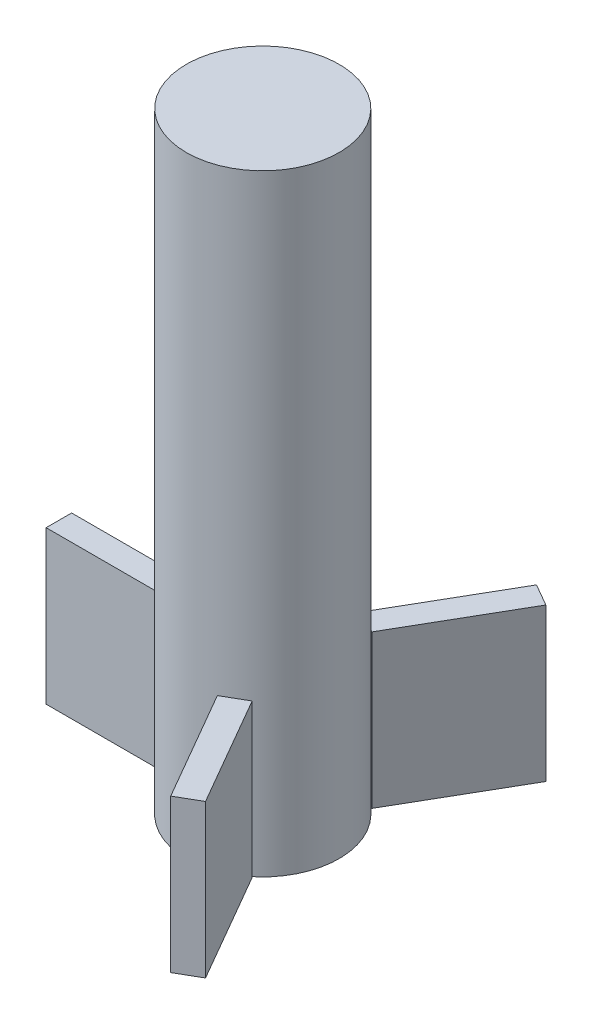
ISO-10303-21;
HEADER;
FILE_DESCRIPTION(('STEP AP214'),'2;1');
FILE_NAME('part.step','',(''),(''),'','','');
FILE_SCHEMA(('AUTOMOTIVE_DESIGN { 1 0 10303 214 1 1 1 1 }'));
ENDSEC;
DATA;
#1=APPLICATION_CONTEXT('core data for automotive mechanical design processes');
#2=APPLICATION_PROTOCOL_DEFINITION('international standard','automotive_design',2000,#1);
#3=PRODUCT_CONTEXT('',#1,'mechanical');
#4=PRODUCT('Part','Part','',(#3));
#5=PRODUCT_RELATED_PRODUCT_CATEGORY('part','',(#4));
#6=PRODUCT_DEFINITION_FORMATION('','',#4);
#7=PRODUCT_DEFINITION_CONTEXT('part definition',#1,'design');
#8=PRODUCT_DEFINITION('design','',#6,#7);
#9=PRODUCT_DEFINITION_SHAPE('','',#8);
#10=(LENGTH_UNIT() NAMED_UNIT(*) SI_UNIT(.MILLI.,.METRE.));
#11=(NAMED_UNIT(*) PLANE_ANGLE_UNIT() SI_UNIT($,.RADIAN.));
#12=(NAMED_UNIT(*) SI_UNIT($,.STERADIAN.) SOLID_ANGLE_UNIT());
#13=UNCERTAINTY_MEASURE_WITH_UNIT(LENGTH_MEASURE(1.E-05),#10,'distance_accuracy_value','');
#14=(GEOMETRIC_REPRESENTATION_CONTEXT(3) GLOBAL_UNCERTAINTY_ASSIGNED_CONTEXT((#13)) GLOBAL_UNIT_ASSIGNED_CONTEXT((#10,
#11,#12)) REPRESENTATION_CONTEXT('',''));
#15=CARTESIAN_POINT('',(0.,0.,0.));
#16=DIRECTION('',(0.,0.,1.));
#17=DIRECTION('',(1.,0.,0.));
#18=AXIS2_PLACEMENT_3D('',#15,#16,#17);
#19=CARTESIAN_POINT('',(9.66506350946091,30.,-11.7403810567671));
#20=DIRECTION('',(-0.5,0.,0.866025403784439));
#21=DIRECTION('',(0.866025403784439,0.,0.5));
#22=AXIS2_PLACEMENT_3D('',#19,#20,#21);
#23=PLANE('',#22);
#24=DIRECTION('',(-0.866025403784439,0.,-0.5));
#25=VECTOR('',#24,1.);
#26=CARTESIAN_POINT('',(9.66506350946091,0.,-11.7403810567671));
#27=LINE('',#26,#25);
#28=CARTESIAN_POINT('',(9.66506350946091,0.,-11.7403810567671));
#29=VERTEX_POINT('',#28);
#30=CARTESIAN_POINT('',(5.33493649053872,0.,-14.2403810567671));
#31=VERTEX_POINT('',#30);
#32=EDGE_CURVE('E109',#29,#31,#27,.T.);
#33=ORIENTED_EDGE('',*,*,#32,.F.);
#34=DIRECTION('',(0.,-1.,0.));
#35=VECTOR('',#34,1.);
#36=CARTESIAN_POINT('',(9.66506350946091,30.,-11.7403810567671));
#37=LINE('',#36,#35);
#38=CARTESIAN_POINT('',(9.66506350946091,30.,-11.7403810567671));
#39=VERTEX_POINT('',#38);
#40=EDGE_CURVE('E12',#39,#29,#37,.T.);
#41=ORIENTED_EDGE('',*,*,#40,.F.);
#42=DIRECTION('',(-0.866025403784439,0.,-0.5));
#43=VECTOR('',#42,1.);
#44=CARTESIAN_POINT('',(9.66506350946091,30.,-11.7403810567671));
#45=LINE('',#44,#43);
#46=CARTESIAN_POINT('',(5.33493649053872,30.,-14.2403810567671));
#47=VERTEX_POINT('',#46);
#48=EDGE_CURVE('E104',#39,#47,#45,.T.);
#49=ORIENTED_EDGE('',*,*,#48,.T.);
#50=DIRECTION('',(0.,-1.,0.));
#51=VECTOR('',#50,1.);
#52=CARTESIAN_POINT('',(5.33493649053872,30.,-14.2403810567671));
#53=LINE('',#52,#51);
#54=EDGE_CURVE('E47',#47,#31,#53,.T.);
#55=ORIENTED_EDGE('',*,*,#54,.T.);
#56=EDGE_LOOP('',(#33,#41,#49,#55));
#57=FACE_BOUND('',#56,.T.);
#58=ADVANCED_FACE('F44',(#57),#23,.T.);
#59=CARTESIAN_POINT('',(9.66506350946091,30.,-11.7403810567671));
#60=DIRECTION('',(-0.866025403784439,0.,-0.5));
#61=DIRECTION('',(-0.5,0.,0.866025403784439));
#62=AXIS2_PLACEMENT_3D('',#59,#60,#61);
#63=PLANE('',#62);
#64=DIRECTION('',(0.5,0.,-0.866025403784439));
#65=VECTOR('',#64,1.);
#66=CARTESIAN_POINT('',(9.66506350946091,0.,-11.7403810567671));
#67=LINE('',#66,#65);
#68=CARTESIAN_POINT('',(22.1650635094609,0.,-33.3910161513781));
#69=VERTEX_POINT('',#68);
#70=EDGE_CURVE('E77',#29,#69,#67,.T.);
#71=ORIENTED_EDGE('',*,*,#70,.T.);
#72=DIRECTION('',(0.,-1.,0.));
#73=VECTOR('',#72,1.);
#74=CARTESIAN_POINT('',(22.1650635094609,30.,-33.3910161513781));
#75=LINE('',#74,#73);
#76=CARTESIAN_POINT('',(22.1650635094609,30.,-33.3910161513781));
#77=VERTEX_POINT('',#76);
#78=EDGE_CURVE('E53',#77,#69,#75,.T.);
#79=ORIENTED_EDGE('',*,*,#78,.F.);
#80=DIRECTION('',(0.5,0.,-0.866025403784439));
#81=VECTOR('',#80,1.);
#82=CARTESIAN_POINT('',(9.66506350946091,30.,-11.7403810567671));
#83=LINE('',#82,#81);
#84=EDGE_CURVE('E94',#39,#77,#83,.T.);
#85=ORIENTED_EDGE('',*,*,#84,.F.);
#86=ORIENTED_EDGE('',*,*,#40,.T.);
#87=EDGE_LOOP('',(#71,#79,#85,#86));
#88=FACE_BOUND('',#87,.T.);
#89=ADVANCED_FACE('F119',(#88),#63,.F.);
#90=CARTESIAN_POINT('',(22.1650635094609,30.,-33.3910161513781));
#91=DIRECTION('',(-0.5,0.,0.866025403784438));
#92=DIRECTION('',(0.866025403784438,0.,0.5));
#93=AXIS2_PLACEMENT_3D('',#90,#91,#92);
#94=PLANE('',#93);
#95=DIRECTION('',(-0.866025403784438,0.,-0.5));
#96=VECTOR('',#95,1.);
#97=CARTESIAN_POINT('',(22.1650635094609,0.,-33.3910161513781));
#98=LINE('',#97,#96);
#99=CARTESIAN_POINT('',(17.8349364905387,0.,-35.8910161513781));
#100=VERTEX_POINT('',#99);
#101=EDGE_CURVE('E101',#69,#100,#98,.T.);
#102=ORIENTED_EDGE('',*,*,#101,.T.);
#103=DIRECTION('',(0.,-1.,0.));
#104=VECTOR('',#103,1.);
#105=CARTESIAN_POINT('',(17.8349364905387,30.,-35.8910161513781));
#106=LINE('',#105,#104);
#107=CARTESIAN_POINT('',(17.8349364905387,30.,-35.8910161513781));
#108=VERTEX_POINT('',#107);
#109=EDGE_CURVE('E98',#108,#100,#106,.T.);
#110=ORIENTED_EDGE('',*,*,#109,.F.);
#111=DIRECTION('',(-0.866025403784438,0.,-0.5));
#112=VECTOR('',#111,1.);
#113=CARTESIAN_POINT('',(22.1650635094609,30.,-33.3910161513781));
#114=LINE('',#113,#112);
#115=EDGE_CURVE('E89',#77,#108,#114,.T.);
#116=ORIENTED_EDGE('',*,*,#115,.F.);
#117=ORIENTED_EDGE('',*,*,#78,.T.);
#118=EDGE_LOOP('',(#102,#110,#116,#117));
#119=FACE_BOUND('',#118,.T.);
#120=ADVANCED_FACE('F99',(#119),#94,.F.);
#121=CARTESIAN_POINT('',(5.33493649053872,30.,-14.2403810567671));
#122=DIRECTION('',(-0.866025403784439,0.,-0.5));
#123=DIRECTION('',(-0.5,0.,0.866025403784439));
#124=AXIS2_PLACEMENT_3D('',#121,#122,#123);
#125=PLANE('',#124);
#126=DIRECTION('',(0.5,0.,-0.866025403784439));
#127=VECTOR('',#126,1.);
#128=CARTESIAN_POINT('',(5.33493649053872,0.,-14.2403810567671));
#129=LINE('',#128,#127);
#130=EDGE_CURVE('E112',#31,#100,#129,.T.);
#131=ORIENTED_EDGE('',*,*,#130,.F.);
#132=ORIENTED_EDGE('',*,*,#54,.F.);
#133=DIRECTION('',(0.5,0.,-0.866025403784439));
#134=VECTOR('',#133,1.);
#135=CARTESIAN_POINT('',(5.33493649053872,30.,-14.2403810567671));
#136=LINE('',#135,#134);
#137=EDGE_CURVE('E93',#47,#108,#136,.T.);
#138=ORIENTED_EDGE('',*,*,#137,.T.);
#139=ORIENTED_EDGE('',*,*,#109,.T.);
#140=EDGE_LOOP('',(#131,#132,#138,#139));
#141=FACE_BOUND('',#140,.T.);
#142=ADVANCED_FACE('F103',(#141),#125,.T.);
#143=CARTESIAN_POINT('',(0.,30.,0.));
#144=DIRECTION('',(0.,-1.,0.));
#145=DIRECTION('',(0.,0.,-1.));
#146=AXIS2_PLACEMENT_3D('',#143,#144,#145);
#147=PLANE('',#146);
#148=ORIENTED_EDGE('',*,*,#48,.F.);
#149=ORIENTED_EDGE('',*,*,#84,.T.);
#150=ORIENTED_EDGE('',*,*,#115,.T.);
#151=ORIENTED_EDGE('',*,*,#137,.F.);
#152=EDGE_LOOP('',(#148,#149,#150,#151));
#153=FACE_BOUND('',#152,.T.);
#154=ADVANCED_FACE('F92',(#153),#147,.F.);
#155=CARTESIAN_POINT('',(0.,0.,0.));
#156=DIRECTION('',(0.,-1.,0.));
#157=DIRECTION('',(0.,0.,-1.));
#158=AXIS2_PLACEMENT_3D('',#155,#156,#157);
#159=PLANE('',#158);
#160=ORIENTED_EDGE('',*,*,#32,.T.);
#161=ORIENTED_EDGE('',*,*,#130,.T.);
#162=ORIENTED_EDGE('',*,*,#101,.F.);
#163=ORIENTED_EDGE('',*,*,#70,.F.);
#164=EDGE_LOOP('',(#160,#161,#162,#163));
#165=FACE_BOUND('',#164,.T.);
#166=ADVANCED_FACE('F117',(#165),#159,.T.);
#167=CLOSED_SHELL('',(#58,#89,#120,#142,#154,#166));
#168=MANIFOLD_SOLID_BREP('B2',#167);
#169=CARTESIAN_POINT('',(-15.,30.,-2.5));
#170=DIRECTION('',(1.,0.,0.));
#171=DIRECTION('',(0.,0.,-1.));
#172=AXIS2_PLACEMENT_3D('',#169,#170,#171);
#173=PLANE('',#172);
#174=DIRECTION('',(0.,0.,1.));
#175=VECTOR('',#174,1.);
#176=CARTESIAN_POINT('',(-15.,0.,-2.5));
#177=LINE('',#176,#175);
#178=CARTESIAN_POINT('',(-15.,0.,-2.5));
#179=VERTEX_POINT('',#178);
#180=CARTESIAN_POINT('',(-15.,0.,2.5));
#181=VERTEX_POINT('',#180);
#182=EDGE_CURVE('E243',#179,#181,#177,.T.);
#183=ORIENTED_EDGE('',*,*,#182,.F.);
#184=DIRECTION('',(0.,-1.,0.));
#185=VECTOR('',#184,1.);
#186=CARTESIAN_POINT('',(-15.,30.,-2.5));
#187=LINE('',#186,#185);
#188=CARTESIAN_POINT('',(-15.,30.,-2.5));
#189=VERTEX_POINT('',#188);
#190=EDGE_CURVE('E42',#189,#179,#187,.T.);
#191=ORIENTED_EDGE('',*,*,#190,.F.);
#192=DIRECTION('',(0.,0.,1.));
#193=VECTOR('',#192,1.);
#194=CARTESIAN_POINT('',(-15.,30.,-2.5));
#195=LINE('',#194,#193);
#196=CARTESIAN_POINT('',(-15.,30.,2.5));
#197=VERTEX_POINT('',#196);
#198=EDGE_CURVE('E238',#189,#197,#195,.T.);
#199=ORIENTED_EDGE('',*,*,#198,.T.);
#200=DIRECTION('',(0.,-1.,0.));
#201=VECTOR('',#200,1.);
#202=CARTESIAN_POINT('',(-15.,30.,2.5));
#203=LINE('',#202,#201);
#204=EDGE_CURVE('E181',#197,#181,#203,.T.);
#205=ORIENTED_EDGE('',*,*,#204,.T.);
#206=EDGE_LOOP('',(#183,#191,#199,#205));
#207=FACE_BOUND('',#206,.T.);
#208=ADVANCED_FACE('F178',(#207),#173,.T.);
#209=CARTESIAN_POINT('',(-15.,30.,-2.5));
#210=DIRECTION('',(0.,0.,1.));
#211=DIRECTION('',(1.,0.,0.));
#212=AXIS2_PLACEMENT_3D('',#209,#210,#211);
#213=PLANE('',#212);
#214=DIRECTION('',(-1.,0.,0.));
#215=VECTOR('',#214,1.);
#216=CARTESIAN_POINT('',(-15.,0.,-2.5));
#217=LINE('',#216,#215);
#218=CARTESIAN_POINT('',(-40.,0.,-2.49999999999999));
#219=VERTEX_POINT('',#218);
#220=EDGE_CURVE('E211',#179,#219,#217,.T.);
#221=ORIENTED_EDGE('',*,*,#220,.T.);
#222=DIRECTION('',(0.,-1.,0.));
#223=VECTOR('',#222,1.);
#224=CARTESIAN_POINT('',(-40.,30.,-2.49999999999999));
#225=LINE('',#224,#223);
#226=CARTESIAN_POINT('',(-40.,30.,-2.49999999999999));
#227=VERTEX_POINT('',#226);
#228=EDGE_CURVE('E187',#227,#219,#225,.T.);
#229=ORIENTED_EDGE('',*,*,#228,.F.);
#230=DIRECTION('',(-1.,0.,0.));
#231=VECTOR('',#230,1.);
#232=CARTESIAN_POINT('',(-15.,30.,-2.5));
#233=LINE('',#232,#231);
#234=EDGE_CURVE('E228',#189,#227,#233,.T.);
#235=ORIENTED_EDGE('',*,*,#234,.F.);
#236=ORIENTED_EDGE('',*,*,#190,.T.);
#237=EDGE_LOOP('',(#221,#229,#235,#236));
#238=FACE_BOUND('',#237,.T.);
#239=ADVANCED_FACE('F253',(#238),#213,.F.);
#240=CARTESIAN_POINT('',(-40.,30.,-2.49999999999999));
#241=DIRECTION('',(1.,0.,0.));
#242=DIRECTION('',(0.,0.,-1.));
#243=AXIS2_PLACEMENT_3D('',#240,#241,#242);
#244=PLANE('',#243);
#245=DIRECTION('',(0.,0.,1.));
#246=VECTOR('',#245,1.);
#247=CARTESIAN_POINT('',(-40.,0.,-2.49999999999999));
#248=LINE('',#247,#246);
#249=CARTESIAN_POINT('',(-40.,0.,2.5));
#250=VERTEX_POINT('',#249);
#251=EDGE_CURVE('E235',#219,#250,#248,.T.);
#252=ORIENTED_EDGE('',*,*,#251,.T.);
#253=DIRECTION('',(0.,-1.,0.));
#254=VECTOR('',#253,1.);
#255=CARTESIAN_POINT('',(-40.,30.,2.5));
#256=LINE('',#255,#254);
#257=CARTESIAN_POINT('',(-40.,30.,2.5));
#258=VERTEX_POINT('',#257);
#259=EDGE_CURVE('E232',#258,#250,#256,.T.);
#260=ORIENTED_EDGE('',*,*,#259,.F.);
#261=DIRECTION('',(0.,0.,1.));
#262=VECTOR('',#261,1.);
#263=CARTESIAN_POINT('',(-40.,30.,-2.49999999999999));
#264=LINE('',#263,#262);
#265=EDGE_CURVE('E223',#227,#258,#264,.T.);
#266=ORIENTED_EDGE('',*,*,#265,.F.);
#267=ORIENTED_EDGE('',*,*,#228,.T.);
#268=EDGE_LOOP('',(#252,#260,#266,#267));
#269=FACE_BOUND('',#268,.T.);
#270=ADVANCED_FACE('F233',(#269),#244,.F.);
#271=CARTESIAN_POINT('',(-15.,30.,2.5));
#272=DIRECTION('',(0.,0.,1.));
#273=DIRECTION('',(1.,0.,0.));
#274=AXIS2_PLACEMENT_3D('',#271,#272,#273);
#275=PLANE('',#274);
#276=DIRECTION('',(-1.,0.,0.));
#277=VECTOR('',#276,1.);
#278=CARTESIAN_POINT('',(-15.,0.,2.5));
#279=LINE('',#278,#277);
#280=EDGE_CURVE('E246',#181,#250,#279,.T.);
#281=ORIENTED_EDGE('',*,*,#280,.F.);
#282=ORIENTED_EDGE('',*,*,#204,.F.);
#283=DIRECTION('',(-1.,0.,0.));
#284=VECTOR('',#283,1.);
#285=CARTESIAN_POINT('',(-15.,30.,2.5));
#286=LINE('',#285,#284);
#287=EDGE_CURVE('E227',#197,#258,#286,.T.);
#288=ORIENTED_EDGE('',*,*,#287,.T.);
#289=ORIENTED_EDGE('',*,*,#259,.T.);
#290=EDGE_LOOP('',(#281,#282,#288,#289));
#291=FACE_BOUND('',#290,.T.);
#292=ADVANCED_FACE('F237',(#291),#275,.T.);
#293=CARTESIAN_POINT('',(0.,30.,0.));
#294=DIRECTION('',(0.,-1.,0.));
#295=DIRECTION('',(0.,0.,-1.));
#296=AXIS2_PLACEMENT_3D('',#293,#294,#295);
#297=PLANE('',#296);
#298=ORIENTED_EDGE('',*,*,#198,.F.);
#299=ORIENTED_EDGE('',*,*,#234,.T.);
#300=ORIENTED_EDGE('',*,*,#265,.T.);
#301=ORIENTED_EDGE('',*,*,#287,.F.);
#302=EDGE_LOOP('',(#298,#299,#300,#301));
#303=FACE_BOUND('',#302,.T.);
#304=ADVANCED_FACE('F226',(#303),#297,.F.);
#305=CARTESIAN_POINT('',(0.,0.,0.));
#306=DIRECTION('',(0.,-1.,0.));
#307=DIRECTION('',(0.,0.,-1.));
#308=AXIS2_PLACEMENT_3D('',#305,#306,#307);
#309=PLANE('',#308);
#310=ORIENTED_EDGE('',*,*,#182,.T.);
#311=ORIENTED_EDGE('',*,*,#280,.T.);
#312=ORIENTED_EDGE('',*,*,#251,.F.);
#313=ORIENTED_EDGE('',*,*,#220,.F.);
#314=EDGE_LOOP('',(#310,#311,#312,#313));
#315=FACE_BOUND('',#314,.T.);
#316=ADVANCED_FACE('F251',(#315),#309,.T.);
#317=CLOSED_SHELL('',(#208,#239,#270,#292,#304,#316));
#318=MANIFOLD_SOLID_BREP('B6',#317);
#319=CARTESIAN_POINT('',(5.33493649053931,30.,14.2403810567661));
#320=DIRECTION('',(0.866025403784438,0.,-0.500000000000001));
#321=DIRECTION('',(-0.500000000000001,0.,-0.866025403784438));
#322=AXIS2_PLACEMENT_3D('',#319,#320,#321);
#323=PLANE('',#322);
#324=DIRECTION('',(0.500000000000001,0.,0.866025403784438));
#325=VECTOR('',#324,1.);
#326=CARTESIAN_POINT('',(5.33493649053931,0.,14.2403810567661));
#327=LINE('',#326,#325);
#328=CARTESIAN_POINT('',(5.33493649053931,0.,14.2403810567661));
#329=VERTEX_POINT('',#328);
#330=CARTESIAN_POINT('',(17.8349364905393,0.,35.8910161513771));
#331=VERTEX_POINT('',#330);
#332=EDGE_CURVE('E372',#329,#331,#327,.T.);
#333=ORIENTED_EDGE('',*,*,#332,.T.);
#334=DIRECTION('',(0.,-1.,0.));
#335=VECTOR('',#334,1.);
#336=CARTESIAN_POINT('',(17.8349364905393,30.,35.8910161513771));
#337=LINE('',#336,#335);
#338=CARTESIAN_POINT('',(17.8349364905393,30.,35.8910161513771));
#339=VERTEX_POINT('',#338);
#340=EDGE_CURVE('E176',#339,#331,#337,.T.);
#341=ORIENTED_EDGE('',*,*,#340,.F.);
#342=DIRECTION('',(0.500000000000001,0.,0.866025403784438));
#343=VECTOR('',#342,1.);
#344=CARTESIAN_POINT('',(5.33493649053931,30.,14.2403810567661));
#345=LINE('',#344,#343);
#346=CARTESIAN_POINT('',(5.33493649053931,30.,14.2403810567661));
#347=VERTEX_POINT('',#346);
#348=EDGE_CURVE('E358',#347,#339,#345,.T.);
#349=ORIENTED_EDGE('',*,*,#348,.F.);
#350=DIRECTION('',(0.,-1.,0.));
#351=VECTOR('',#350,1.);
#352=CARTESIAN_POINT('',(5.33493649053931,30.,14.2403810567661));
#353=LINE('',#352,#351);
#354=EDGE_CURVE('E325',#347,#329,#353,.T.);
#355=ORIENTED_EDGE('',*,*,#354,.T.);
#356=EDGE_LOOP('',(#333,#341,#349,#355));
#357=FACE_BOUND('',#356,.T.);
#358=ADVANCED_FACE('F309',(#357),#323,.F.);
#359=CARTESIAN_POINT('',(17.8349364905393,30.,35.8910161513771));
#360=DIRECTION('',(-0.499999999999999,0.,-0.866025403784439));
#361=DIRECTION('',(-0.866025403784439,0.,0.499999999999999));
#362=AXIS2_PLACEMENT_3D('',#359,#360,#361);
#363=PLANE('',#362);
#364=DIRECTION('',(0.866025403784439,0.,-0.499999999999999));
#365=VECTOR('',#364,1.);
#366=CARTESIAN_POINT('',(17.8349364905393,0.,35.8910161513771));
#367=LINE('',#366,#365);
#368=CARTESIAN_POINT('',(22.1650635094615,0.,33.3910161513771));
#369=VERTEX_POINT('',#368);
#370=EDGE_CURVE('E363',#331,#369,#367,.T.);
#371=ORIENTED_EDGE('',*,*,#370,.T.);
#372=DIRECTION('',(0.,-1.,0.));
#373=VECTOR('',#372,1.);
#374=CARTESIAN_POINT('',(22.1650635094615,30.,33.3910161513771));
#375=LINE('',#374,#373);
#376=CARTESIAN_POINT('',(22.1650635094615,30.,33.3910161513771));
#377=VERTEX_POINT('',#376);
#378=EDGE_CURVE('E317',#377,#369,#375,.T.);
#379=ORIENTED_EDGE('',*,*,#378,.F.);
#380=DIRECTION('',(0.866025403784439,0.,-0.499999999999999));
#381=VECTOR('',#380,1.);
#382=CARTESIAN_POINT('',(17.8349364905393,30.,35.8910161513771));
#383=LINE('',#382,#381);
#384=EDGE_CURVE('E350',#339,#377,#383,.T.);
#385=ORIENTED_EDGE('',*,*,#384,.F.);
#386=ORIENTED_EDGE('',*,*,#340,.T.);
#387=EDGE_LOOP('',(#371,#379,#385,#386));
#388=FACE_BOUND('',#387,.T.);
#389=ADVANCED_FACE('F362',(#388),#363,.F.);
#390=CARTESIAN_POINT('',(9.6650635094615,30.,11.7403810567661));
#391=DIRECTION('',(0.866025403784438,0.,-0.5));
#392=DIRECTION('',(-0.5,0.,-0.866025403784438));
#393=AXIS2_PLACEMENT_3D('',#390,#391,#392);
#394=PLANE('',#393);
#395=DIRECTION('',(0.5,0.,0.866025403784438));
#396=VECTOR('',#395,1.);
#397=CARTESIAN_POINT('',(9.6650635094615,0.,11.7403810567661));
#398=LINE('',#397,#396);
#399=CARTESIAN_POINT('',(9.6650635094615,0.,11.7403810567661));
#400=VERTEX_POINT('',#399);
#401=EDGE_CURVE('E375',#400,#369,#398,.T.);
#402=ORIENTED_EDGE('',*,*,#401,.F.);
#403=DIRECTION('',(0.,-1.,0.));
#404=VECTOR('',#403,1.);
#405=CARTESIAN_POINT('',(9.6650635094615,30.,11.7403810567661));
#406=LINE('',#405,#404);
#407=CARTESIAN_POINT('',(9.6650635094615,30.,11.7403810567661));
#408=VERTEX_POINT('',#407);
#409=EDGE_CURVE('E339',#408,#400,#406,.T.);
#410=ORIENTED_EDGE('',*,*,#409,.F.);
#411=DIRECTION('',(0.5,0.,0.866025403784438));
#412=VECTOR('',#411,1.);
#413=CARTESIAN_POINT('',(9.6650635094615,30.,11.7403810567661));
#414=LINE('',#413,#412);
#415=EDGE_CURVE('E357',#408,#377,#414,.T.);
#416=ORIENTED_EDGE('',*,*,#415,.T.);
#417=ORIENTED_EDGE('',*,*,#378,.T.);
#418=EDGE_LOOP('',(#402,#410,#416,#417));
#419=FACE_BOUND('',#418,.T.);
#420=ADVANCED_FACE('F366',(#419),#394,.T.);
#421=CARTESIAN_POINT('',(5.33493649053931,30.,14.2403810567661));
#422=DIRECTION('',(-0.500000000000001,0.,-0.866025403784438));
#423=DIRECTION('',(-0.866025403784438,0.,0.500000000000001));
#424=AXIS2_PLACEMENT_3D('',#421,#422,#423);
#425=PLANE('',#424);
#426=DIRECTION('',(0.866025403784438,0.,-0.500000000000001));
#427=VECTOR('',#426,1.);
#428=CARTESIAN_POINT('',(5.33493649053931,0.,14.2403810567661));
#429=LINE('',#428,#427);
#430=EDGE_CURVE('E377',#329,#400,#429,.T.);
#431=ORIENTED_EDGE('',*,*,#430,.F.);
#432=ORIENTED_EDGE('',*,*,#354,.F.);
#433=DIRECTION('',(0.866025403784438,0.,-0.500000000000001));
#434=VECTOR('',#433,1.);
#435=CARTESIAN_POINT('',(5.33493649053931,30.,14.2403810567661));
#436=LINE('',#435,#434);
#437=EDGE_CURVE('E367',#347,#408,#436,.T.);
#438=ORIENTED_EDGE('',*,*,#437,.T.);
#439=ORIENTED_EDGE('',*,*,#409,.T.);
#440=EDGE_LOOP('',(#431,#432,#438,#439));
#441=FACE_BOUND('',#440,.T.);
#442=ADVANCED_FACE('F383',(#441),#425,.T.);
#443=CARTESIAN_POINT('',(0.,30.,0.));
#444=DIRECTION('',(0.,1.,0.));
#445=DIRECTION('',(0.,0.,1.));
#446=AXIS2_PLACEMENT_3D('',#443,#444,#445);
#447=PLANE('',#446);
#448=ORIENTED_EDGE('',*,*,#348,.T.);
#449=ORIENTED_EDGE('',*,*,#384,.T.);
#450=ORIENTED_EDGE('',*,*,#415,.F.);
#451=ORIENTED_EDGE('',*,*,#437,.F.);
#452=EDGE_LOOP('',(#448,#449,#450,#451));
#453=FACE_BOUND('',#452,.T.);
#454=ADVANCED_FACE('F354',(#453),#447,.T.);
#455=CARTESIAN_POINT('',(0.,0.,0.));
#456=DIRECTION('',(0.,1.,0.));
#457=DIRECTION('',(0.,0.,1.));
#458=AXIS2_PLACEMENT_3D('',#455,#456,#457);
#459=PLANE('',#458);
#460=ORIENTED_EDGE('',*,*,#332,.F.);
#461=ORIENTED_EDGE('',*,*,#430,.T.);
#462=ORIENTED_EDGE('',*,*,#401,.T.);
#463=ORIENTED_EDGE('',*,*,#370,.F.);
#464=EDGE_LOOP('',(#460,#461,#462,#463));
#465=FACE_BOUND('',#464,.T.);
#466=ADVANCED_FACE('F382',(#465),#459,.F.);
#467=CLOSED_SHELL('',(#358,#389,#420,#442,#454,#466));
#468=MANIFOLD_SOLID_BREP('B36',#467);
#469=CARTESIAN_POINT('',(0.,120.,0.));
#470=DIRECTION('',(0.,-1.,0.));
#471=DIRECTION('',(0.,0.,-1.));
#472=AXIS2_PLACEMENT_3D('',#469,#470,#471);
#473=CYLINDRICAL_SURFACE('',#472,15.);
#474=CARTESIAN_POINT('',(0.,120.,0.));
#475=DIRECTION('',(0.,1.,0.));
#476=DIRECTION('',(0.,0.,1.));
#477=AXIS2_PLACEMENT_3D('',#474,#475,#476);
#478=CIRCLE('',#477,15.);
#479=CARTESIAN_POINT('',(0.,120.,15.));
#480=VERTEX_POINT('',#479);
#481=EDGE_CURVE('E308',#480,#480,#478,.T.);
#482=ORIENTED_EDGE('',*,*,#481,.F.);
#483=EDGE_LOOP('',(#482));
#484=FACE_BOUND('',#483,.T.);
#485=CARTESIAN_POINT('',(0.,0.,0.));
#486=DIRECTION('',(0.,1.,0.));
#487=DIRECTION('',(0.,0.,1.));
#488=AXIS2_PLACEMENT_3D('',#485,#486,#487);
#489=CIRCLE('',#488,15.);
#490=CARTESIAN_POINT('',(0.,0.,15.));
#491=VERTEX_POINT('',#490);
#492=EDGE_CURVE('E436',#491,#491,#489,.T.);
#493=ORIENTED_EDGE('',*,*,#492,.T.);
#494=EDGE_LOOP('',(#493));
#495=FACE_BOUND('',#494,.T.);
#496=ADVANCED_FACE('F433',(#484,#495),#473,.T.);
#497=CARTESIAN_POINT('',(0.,120.,0.));
#498=DIRECTION('',(0.,1.,0.));
#499=DIRECTION('',(0.,0.,1.));
#500=AXIS2_PLACEMENT_3D('',#497,#498,#499);
#501=PLANE('',#500);
#502=ORIENTED_EDGE('',*,*,#481,.T.);
#503=EDGE_LOOP('',(#502));
#504=FACE_BOUND('',#503,.T.);
#505=ADVANCED_FACE('F448',(#504),#501,.T.);
#506=CARTESIAN_POINT('',(0.,0.,0.));
#507=DIRECTION('',(0.,1.,0.));
#508=DIRECTION('',(0.,0.,1.));
#509=AXIS2_PLACEMENT_3D('',#506,#507,#508);
#510=PLANE('',#509);
#511=ORIENTED_EDGE('',*,*,#492,.F.);
#512=EDGE_LOOP('',(#511));
#513=FACE_BOUND('',#512,.T.);
#514=ADVANCED_FACE('F446',(#513),#510,.F.);
#515=CLOSED_SHELL('',(#496,#505,#514));
#516=MANIFOLD_SOLID_BREP('B170',#515);
#517=ADVANCED_BREP_SHAPE_REPRESENTATION('',(#18,#168,#318,#468,#516),#14);
#518=SHAPE_DEFINITION_REPRESENTATION(#9,#517);
ENDSEC;
END-ISO-10303-21;
